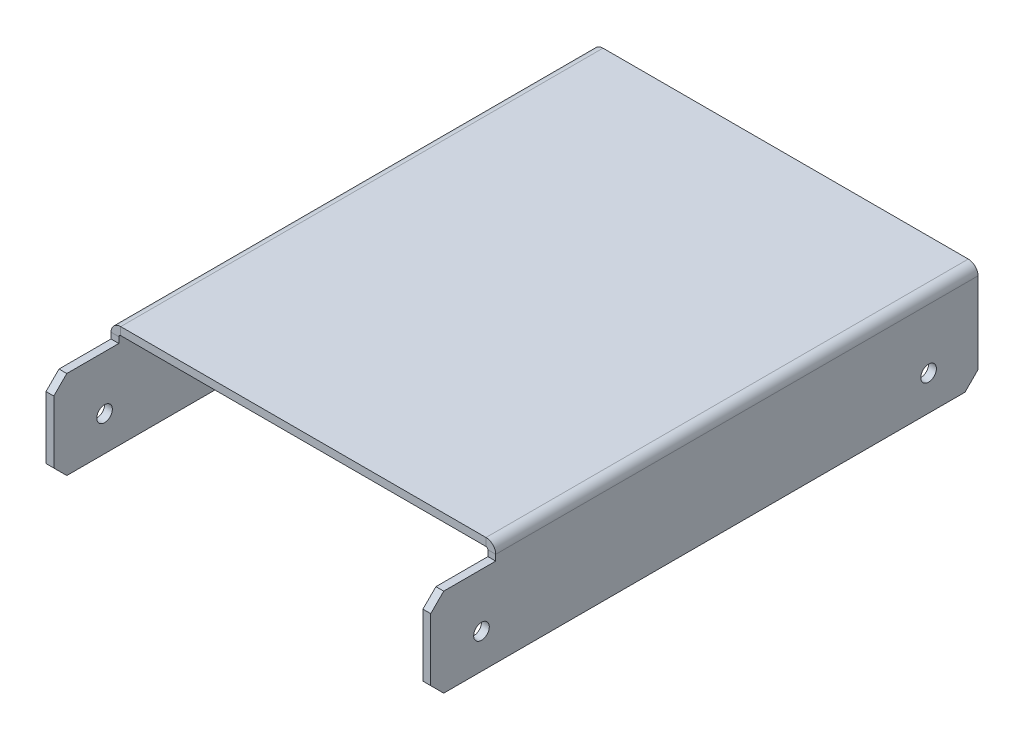
ISO-10303-21;
HEADER;
FILE_DESCRIPTION(('STEP AP214'),'2;1');
FILE_NAME('part.step','',(''),(''),'','','');
FILE_SCHEMA(('AUTOMOTIVE_DESIGN { 1 0 10303 214 1 1 1 1 }'));
ENDSEC;
DATA;
#1=APPLICATION_CONTEXT('core data for automotive mechanical design processes');
#2=APPLICATION_PROTOCOL_DEFINITION('international standard','automotive_design',2000,#1);
#3=PRODUCT_CONTEXT('',#1,'mechanical');
#4=PRODUCT('Part','Part','',(#3));
#5=PRODUCT_RELATED_PRODUCT_CATEGORY('part','',(#4));
#6=PRODUCT_DEFINITION_FORMATION('','',#4);
#7=PRODUCT_DEFINITION_CONTEXT('part definition',#1,'design');
#8=PRODUCT_DEFINITION('design','',#6,#7);
#9=PRODUCT_DEFINITION_SHAPE('','',#8);
#10=(LENGTH_UNIT() NAMED_UNIT(*) SI_UNIT(.MILLI.,.METRE.));
#11=(NAMED_UNIT(*) PLANE_ANGLE_UNIT() SI_UNIT($,.RADIAN.));
#12=(NAMED_UNIT(*) SI_UNIT($,.STERADIAN.) SOLID_ANGLE_UNIT());
#13=UNCERTAINTY_MEASURE_WITH_UNIT(LENGTH_MEASURE(1.E-05),#10,'distance_accuracy_value','');
#14=(GEOMETRIC_REPRESENTATION_CONTEXT(3) GLOBAL_UNCERTAINTY_ASSIGNED_CONTEXT((#13)) GLOBAL_UNIT_ASSIGNED_CONTEXT((#10,
#11,#12)) REPRESENTATION_CONTEXT('',''));
#15=CARTESIAN_POINT('',(0.,0.,0.));
#16=DIRECTION('',(0.,0.,1.));
#17=DIRECTION('',(1.,0.,0.));
#18=AXIS2_PLACEMENT_3D('',#15,#16,#17);
#19=CARTESIAN_POINT('',(0.,0.,141.336888069935));
#20=DIRECTION('',(0.,0.,-1.));
#21=DIRECTION('',(-1.,0.,0.));
#22=AXIS2_PLACEMENT_3D('',#19,#20,#21);
#23=PLANE('',#22);
#24=DIRECTION('',(0.,1.,0.));
#25=VECTOR('',#24,1.);
#26=CARTESIAN_POINT('',(-145.,5.55111512312578E-13,141.336888069935));
#27=LINE('',#26,#25);
#28=CARTESIAN_POINT('',(-145.,-6.,141.336888069935));
#29=VERTEX_POINT('',#28);
#30=CARTESIAN_POINT('',(-145.,-3.73660000000001,141.336888069935));
#31=VERTEX_POINT('',#30);
#32=EDGE_CURVE('E422',#29,#31,#27,.T.);
#33=ORIENTED_EDGE('',*,*,#32,.T.);
#34=DIRECTION('',(-1.,0.,0.));
#35=VECTOR('',#34,1.);
#36=CARTESIAN_POINT('',(-145.,-3.73660000000001,141.336888069935));
#37=LINE('',#36,#35);
#38=CARTESIAN_POINT('',(-148.,-3.7366,141.336888069935));
#39=VERTEX_POINT('',#38);
#40=EDGE_CURVE('E445',#31,#39,#37,.T.);
#41=ORIENTED_EDGE('',*,*,#40,.T.);
#42=DIRECTION('',(0.,1.,0.));
#43=VECTOR('',#42,1.);
#44=CARTESIAN_POINT('',(-148.,5.65585956329108E-13,141.336888069935));
#45=LINE('',#44,#43);
#46=CARTESIAN_POINT('',(-148.,-6.,141.336888069935));
#47=VERTEX_POINT('',#46);
#48=EDGE_CURVE('E315',#47,#39,#45,.T.);
#49=ORIENTED_EDGE('',*,*,#48,.F.);
#50=DIRECTION('',(1.,0.,0.));
#51=VECTOR('',#50,1.);
#52=CARTESIAN_POINT('',(-159.,-6.,141.336888069935));
#53=LINE('',#52,#51);
#54=EDGE_CURVE('E301',#47,#29,#53,.T.);
#55=ORIENTED_EDGE('',*,*,#54,.T.);
#56=EDGE_LOOP('',(#33,#41,#49,#55));
#57=FACE_BOUND('',#56,.T.);
#58=ADVANCED_FACE('F84',(#57),#23,.F.);
#59=DIRECTION('',(1.,0.,0.));
#60=VECTOR('',#59,1.);
#61=CARTESIAN_POINT('',(0.,0.,141.336888069935));
#62=LINE('',#61,#60);
#63=CARTESIAN_POINT('',(-144.2634,0.,141.336888069935));
#64=VERTEX_POINT('',#63);
#65=CARTESIAN_POINT('',(-3.73660000000001,0.,141.336888069935));
#66=VERTEX_POINT('',#65);
#67=EDGE_CURVE('E323',#64,#66,#62,.T.);
#68=ORIENTED_EDGE('',*,*,#67,.F.);
#69=DIRECTION('',(0.,-1.,0.));
#70=VECTOR('',#69,1.);
#71=CARTESIAN_POINT('',(-144.2634,0.,141.336888069935));
#72=LINE('',#71,#70);
#73=CARTESIAN_POINT('',(-144.2634,-3.00000000000001,141.336888069935));
#74=VERTEX_POINT('',#73);
#75=EDGE_CURVE('E442',#64,#74,#72,.T.);
#76=ORIENTED_EDGE('',*,*,#75,.T.);
#77=DIRECTION('',(1.,0.,0.));
#78=VECTOR('',#77,1.);
#79=CARTESIAN_POINT('',(0.,-3.,141.336888069935));
#80=LINE('',#79,#78);
#81=CARTESIAN_POINT('',(-3.73660000000001,-3.,141.336888069935));
#82=VERTEX_POINT('',#81);
#83=EDGE_CURVE('E306',#74,#82,#80,.T.);
#84=ORIENTED_EDGE('',*,*,#83,.T.);
#85=DIRECTION('',(0.,1.,0.));
#86=VECTOR('',#85,1.);
#87=CARTESIAN_POINT('',(-3.73660000000001,-3.,141.336888069935));
#88=LINE('',#87,#86);
#89=EDGE_CURVE('E439',#82,#66,#88,.T.);
#90=ORIENTED_EDGE('',*,*,#89,.T.);
#91=EDGE_LOOP('',(#68,#76,#84,#90));
#92=FACE_BOUND('',#91,.T.);
#93=ADVANCED_FACE('F585',(#92),#23,.F.);
#94=ORIENTED_EDGE('',*,*,#40,.F.);
#95=CARTESIAN_POINT('',(-144.2634,-3.73660000000001,141.336888069935));
#96=DIRECTION('',(0.,0.,-1.));
#97=DIRECTION('',(-1.,0.,0.));
#98=AXIS2_PLACEMENT_3D('',#95,#96,#97);
#99=CIRCLE('',#98,0.736600000000004);
#100=EDGE_CURVE('E302',#74,#31,#99,.F.);
#101=ORIENTED_EDGE('',*,*,#100,.F.);
#102=ORIENTED_EDGE('',*,*,#75,.F.);
#103=CARTESIAN_POINT('',(-144.2634,-3.73660000000001,141.336888069935));
#104=DIRECTION('',(0.,0.,-1.));
#105=DIRECTION('',(-1.,0.,0.));
#106=AXIS2_PLACEMENT_3D('',#103,#104,#105);
#107=CIRCLE('',#106,3.7366);
#108=EDGE_CURVE('E319',#64,#39,#107,.F.);
#109=ORIENTED_EDGE('',*,*,#108,.T.);
#110=EDGE_LOOP('',(#94,#101,#102,#109));
#111=FACE_BOUND('',#110,.T.);
#112=ADVANCED_FACE('F592',(#111),#23,.F.);
#113=DIRECTION('',(0.,-1.,0.));
#114=VECTOR('',#113,1.);
#115=CARTESIAN_POINT('',(0.,0.,141.336888069935));
#116=LINE('',#115,#114);
#117=CARTESIAN_POINT('',(0.,-3.73659999999999,141.336888069935));
#118=VERTEX_POINT('',#117);
#119=CARTESIAN_POINT('',(0.,-6.,141.336888069935));
#120=VERTEX_POINT('',#119);
#121=EDGE_CURVE('E331',#118,#120,#116,.T.);
#122=ORIENTED_EDGE('',*,*,#121,.F.);
#123=DIRECTION('',(-1.,0.,0.));
#124=VECTOR('',#123,1.);
#125=CARTESIAN_POINT('',(0.,-3.73659999999999,141.336888069935));
#126=LINE('',#125,#124);
#127=CARTESIAN_POINT('',(-3.,-3.7366,141.336888069935));
#128=VERTEX_POINT('',#127);
#129=EDGE_CURVE('E436',#118,#128,#126,.T.);
#130=ORIENTED_EDGE('',*,*,#129,.T.);
#131=DIRECTION('',(0.,-1.,0.));
#132=VECTOR('',#131,1.);
#133=CARTESIAN_POINT('',(-3.00000000000001,0.,141.336888069935));
#134=LINE('',#133,#132);
#135=CARTESIAN_POINT('',(-3.,-6.,141.336888069935));
#136=VERTEX_POINT('',#135);
#137=EDGE_CURVE('E312',#128,#136,#134,.T.);
#138=ORIENTED_EDGE('',*,*,#137,.T.);
#139=EDGE_CURVE('E297',#136,#120,#53,.T.);
#140=ORIENTED_EDGE('',*,*,#139,.T.);
#141=EDGE_LOOP('',(#122,#130,#138,#140));
#142=FACE_BOUND('',#141,.T.);
#143=ADVANCED_FACE('F555',(#142),#23,.F.);
#144=CARTESIAN_POINT('',(0.,-3.,0.));
#145=DIRECTION('',(0.,-1.,0.));
#146=DIRECTION('',(0.,0.,-1.));
#147=AXIS2_PLACEMENT_3D('',#144,#145,#146);
#148=PLANE('',#147);
#149=ORIENTED_EDGE('',*,*,#83,.F.);
#150=DIRECTION('',(0.,0.,-1.));
#151=VECTOR('',#150,1.);
#152=CARTESIAN_POINT('',(-144.2634,-3.00000000000001,-39.1965119300641));
#153=LINE('',#152,#151);
#154=CARTESIAN_POINT('',(-144.2634,-3.00000000000001,-44.1965119300641));
#155=VERTEX_POINT('',#154);
#156=EDGE_CURVE('E256',#155,#74,#153,.F.);
#157=ORIENTED_EDGE('',*,*,#156,.F.);
#158=DIRECTION('',(-1.,0.,0.));
#159=VECTOR('',#158,1.);
#160=CARTESIAN_POINT('',(-3.73660000000001,-3.,-44.1965119300641));
#161=LINE('',#160,#159);
#162=CARTESIAN_POINT('',(-3.73660000000001,-3.,-44.1965119300641));
#163=VERTEX_POINT('',#162);
#164=EDGE_CURVE('E253',#163,#155,#161,.T.);
#165=ORIENTED_EDGE('',*,*,#164,.F.);
#166=DIRECTION('',(0.,0.,1.));
#167=VECTOR('',#166,1.);
#168=CARTESIAN_POINT('',(-3.7366,-3.,166.336888069935));
#169=LINE('',#168,#167);
#170=EDGE_CURVE('E238',#82,#163,#169,.F.);
#171=ORIENTED_EDGE('',*,*,#170,.F.);
#172=EDGE_LOOP('',(#149,#157,#165,#171));
#173=FACE_BOUND('',#172,.T.);
#174=ADVANCED_FACE('F254',(#173),#148,.T.);
#175=CARTESIAN_POINT('',(0.,0.,0.));
#176=DIRECTION('',(0.,-1.,0.));
#177=DIRECTION('',(0.,0.,-1.));
#178=AXIS2_PLACEMENT_3D('',#175,#176,#177);
#179=PLANE('',#178);
#180=DIRECTION('',(0.,0.,-1.));
#181=VECTOR('',#180,1.);
#182=CARTESIAN_POINT('',(-144.2634,0.,-39.1965119300641));
#183=LINE('',#182,#181);
#184=CARTESIAN_POINT('',(-144.2634,0.,-44.1965119300641));
#185=VERTEX_POINT('',#184);
#186=EDGE_CURVE('E394',#185,#64,#183,.F.);
#187=ORIENTED_EDGE('',*,*,#186,.T.);
#188=ORIENTED_EDGE('',*,*,#67,.T.);
#189=DIRECTION('',(0.,0.,1.));
#190=VECTOR('',#189,1.);
#191=CARTESIAN_POINT('',(-3.7366,0.,166.336888069935));
#192=LINE('',#191,#190);
#193=CARTESIAN_POINT('',(-3.73660000000001,0.,-44.1965119300641));
#194=VERTEX_POINT('',#193);
#195=EDGE_CURVE('E249',#66,#194,#192,.F.);
#196=ORIENTED_EDGE('',*,*,#195,.T.);
#197=DIRECTION('',(1.,0.,0.));
#198=VECTOR('',#197,1.);
#199=CARTESIAN_POINT('',(-144.2634,0.,-44.1965119300641));
#200=LINE('',#199,#198);
#201=EDGE_CURVE('E284',#185,#194,#200,.T.);
#202=ORIENTED_EDGE('',*,*,#201,.F.);
#203=EDGE_LOOP('',(#187,#188,#196,#202));
#204=FACE_BOUND('',#203,.T.);
#205=ADVANCED_FACE('F530',(#204),#179,.F.);
#206=CARTESIAN_POINT('',(-3.7366,-3.7366,166.336888069935));
#207=DIRECTION('',(0.,0.,1.));
#208=DIRECTION('',(1.,0.,0.));
#209=AXIS2_PLACEMENT_3D('',#206,#207,#208);
#210=CYLINDRICAL_SURFACE('',#209,3.7366);
#211=CARTESIAN_POINT('',(-3.7366,-3.7366,141.336888069935));
#212=DIRECTION('',(0.,0.,-1.));
#213=DIRECTION('',(-1.,0.,0.));
#214=AXIS2_PLACEMENT_3D('',#211,#212,#213);
#215=CIRCLE('',#214,3.7366);
#216=EDGE_CURVE('E327',#118,#66,#215,.F.);
#217=ORIENTED_EDGE('',*,*,#216,.F.);
#218=DIRECTION('',(0.,0.,1.));
#219=VECTOR('',#218,1.);
#220=CARTESIAN_POINT('',(0.,-3.73659999999999,-39.1965119300641));
#221=LINE('',#220,#219);
#222=CARTESIAN_POINT('',(0.,-3.73659999999999,-44.1965119300641));
#223=VERTEX_POINT('',#222);
#224=EDGE_CURVE('E416',#118,#223,#221,.F.);
#225=ORIENTED_EDGE('',*,*,#224,.T.);
#226=CARTESIAN_POINT('',(-3.7366,-3.7366,-44.1965119300641));
#227=DIRECTION('',(0.,0.,-1.));
#228=DIRECTION('',(-1.,0.,0.));
#229=AXIS2_PLACEMENT_3D('',#226,#227,#228);
#230=CIRCLE('',#229,3.7366);
#231=EDGE_CURVE('E288',#194,#223,#230,.T.);
#232=ORIENTED_EDGE('',*,*,#231,.F.);
#233=ORIENTED_EDGE('',*,*,#195,.F.);
#234=EDGE_LOOP('',(#217,#225,#232,#233));
#235=FACE_BOUND('',#234,.T.);
#236=ADVANCED_FACE('F535',(#235),#210,.T.);
#237=CARTESIAN_POINT('',(-3.7366,-3.7366,166.336888069935));
#238=DIRECTION('',(0.,0.,1.));
#239=DIRECTION('',(1.,0.,0.));
#240=AXIS2_PLACEMENT_3D('',#237,#238,#239);
#241=CYLINDRICAL_SURFACE('',#240,0.7366);
#242=DIRECTION('',(0.,0.,1.));
#243=VECTOR('',#242,1.);
#244=CARTESIAN_POINT('',(-3.,-3.7366,-39.1965119300641));
#245=LINE('',#244,#243);
#246=CARTESIAN_POINT('',(-3.,-3.7366,-44.1965119300641));
#247=VERTEX_POINT('',#246);
#248=EDGE_CURVE('E398',#247,#128,#245,.T.);
#249=ORIENTED_EDGE('',*,*,#248,.T.);
#250=CARTESIAN_POINT('',(-3.7366,-3.7366,141.336888069935));
#251=DIRECTION('',(0.,0.,-1.));
#252=DIRECTION('',(-1.,0.,0.));
#253=AXIS2_PLACEMENT_3D('',#250,#251,#252);
#254=CIRCLE('',#253,0.7366);
#255=EDGE_CURVE('E245',#128,#82,#254,.F.);
#256=ORIENTED_EDGE('',*,*,#255,.T.);
#257=ORIENTED_EDGE('',*,*,#170,.T.);
#258=CARTESIAN_POINT('',(-3.7366,-3.7366,-44.1965119300641));
#259=DIRECTION('',(0.,0.,1.));
#260=DIRECTION('',(-1.,0.,0.));
#261=AXIS2_PLACEMENT_3D('',#258,#259,#260);
#262=CIRCLE('',#261,0.7366);
#263=EDGE_CURVE('E243',#247,#163,#262,.T.);
#264=ORIENTED_EDGE('',*,*,#263,.F.);
#265=EDGE_LOOP('',(#249,#256,#257,#264));
#266=FACE_BOUND('',#265,.T.);
#267=ADVANCED_FACE('F241',(#266),#241,.F.);
#268=CARTESIAN_POINT('',(1.29236898960272E-13,-40.,166.336888069935));
#269=DIRECTION('',(0.,0.,-1.));
#270=DIRECTION('',(-1.,0.,0.));
#271=AXIS2_PLACEMENT_3D('',#268,#269,#270);
#272=PLANE('',#271);
#273=DIRECTION('',(0.,1.,0.));
#274=VECTOR('',#273,1.);
#275=CARTESIAN_POINT('',(-2.99999999999987,-40.,166.336888069935));
#276=LINE('',#275,#274);
#277=CARTESIAN_POINT('',(-2.99999999999997,-11.,166.336888069935));
#278=VERTEX_POINT('',#277);
#279=CARTESIAN_POINT('',(-2.99999999999989,-35.,166.336888069935));
#280=VERTEX_POINT('',#279);
#281=EDGE_CURVE('E412',#278,#280,#276,.F.);
#282=ORIENTED_EDGE('',*,*,#281,.T.);
#283=DIRECTION('',(1.,0.,0.));
#284=VECTOR('',#283,1.);
#285=CARTESIAN_POINT('',(1.11779492266056E-13,-35.,166.336888069935));
#286=LINE('',#285,#284);
#287=CARTESIAN_POINT('',(1.11793506003649E-13,-35.,166.336888069935));
#288=VERTEX_POINT('',#287);
#289=EDGE_CURVE('E467',#280,#288,#286,.T.);
#290=ORIENTED_EDGE('',*,*,#289,.T.);
#291=DIRECTION('',(0.,-1.,0.));
#292=VECTOR('',#291,1.);
#293=CARTESIAN_POINT('',(0.,0.,166.336888069935));
#294=LINE('',#293,#292);
#295=CARTESIAN_POINT('',(0.,-11.,166.336888069935));
#296=VERTEX_POINT('',#295);
#297=EDGE_CURVE('E404',#296,#288,#294,.T.);
#298=ORIENTED_EDGE('',*,*,#297,.F.);
#299=DIRECTION('',(-1.,0.,0.));
#300=VECTOR('',#299,1.);
#301=CARTESIAN_POINT('',(1.29236898960272E-13,-11.,166.336888069935));
#302=LINE('',#301,#300);
#303=EDGE_CURVE('E464',#296,#278,#302,.T.);
#304=ORIENTED_EDGE('',*,*,#303,.T.);
#305=EDGE_LOOP('',(#282,#290,#298,#304));
#306=FACE_BOUND('',#305,.T.);
#307=ADVANCED_FACE('F564',(#306),#272,.F.);
#308=CARTESIAN_POINT('',(0.,0.,0.));
#309=DIRECTION('',(-1.,0.,0.));
#310=DIRECTION('',(0.,-1.,0.));
#311=AXIS2_PLACEMENT_3D('',#308,#309,#310);
#312=PLANE('',#311);
#313=CARTESIAN_POINT('',(1.66533453693773E-13,-26.6400000000005,-25.1965119300641));
#314=DIRECTION('',(-1.,0.,0.));
#315=DIRECTION('',(0.,-1.,0.));
#316=AXIS2_PLACEMENT_3D('',#313,#314,#315);
#317=CIRCLE('',#316,2.99999999999999);
#318=CARTESIAN_POINT('',(1.57281595155231E-13,-29.6400000000005,-25.1965119300641));
#319=VERTEX_POINT('',#318);
#320=EDGE_CURVE('E347',#319,#319,#317,.T.);
#321=ORIENTED_EDGE('',*,*,#320,.T.);
#322=EDGE_LOOP('',(#321));
#323=FACE_BOUND('',#322,.T.);
#324=CARTESIAN_POINT('',(1.66533453693773E-13,-26.6400000000005,146.806888069935));
#325=DIRECTION('',(-1.,0.,0.));
#326=DIRECTION('',(0.,-1.,0.));
#327=AXIS2_PLACEMENT_3D('',#324,#325,#326);
#328=CIRCLE('',#327,2.99999999999999);
#329=CARTESIAN_POINT('',(1.57281595155231E-13,-29.6400000000005,146.806888069935));
#330=VERTEX_POINT('',#329);
#331=EDGE_CURVE('E356',#330,#330,#328,.T.);
#332=ORIENTED_EDGE('',*,*,#331,.T.);
#333=EDGE_LOOP('',(#332));
#334=FACE_BOUND('',#333,.T.);
#335=ORIENTED_EDGE('',*,*,#297,.T.);
#336=DIRECTION('',(0.,0.707106781186551,0.707106781186544));
#337=VECTOR('',#336,1.);
#338=CARTESIAN_POINT('',(1.29236898960272E-13,-40.,161.336888069935));
#339=LINE('',#338,#337);
#340=CARTESIAN_POINT('',(1.29250912697865E-13,-40.,161.336888069935));
#341=VERTEX_POINT('',#340);
#342=EDGE_CURVE('E476',#288,#341,#339,.F.);
#343=ORIENTED_EDGE('',*,*,#342,.T.);
#344=DIRECTION('',(0.,0.,-1.));
#345=VECTOR('',#344,1.);
#346=CARTESIAN_POINT('',(1.29250912697865E-13,-40.,0.));
#347=LINE('',#346,#345);
#348=CARTESIAN_POINT('',(1.29250912697865E-13,-40.,-39.1965119300641));
#349=VERTEX_POINT('',#348);
#350=EDGE_CURVE('E250',#341,#349,#347,.T.);
#351=ORIENTED_EDGE('',*,*,#350,.T.);
#352=DIRECTION('',(0.,0.707106781186543,-0.707106781186552));
#353=VECTOR('',#352,1.);
#354=CARTESIAN_POINT('',(1.11889664200504E-13,-35.,-44.1965119300641));
#355=LINE('',#354,#353);
#356=CARTESIAN_POINT('',(1.11788563954518E-13,-35.,-44.1965119300641));
#357=VERTEX_POINT('',#356);
#358=EDGE_CURVE('E470',#349,#357,#355,.T.);
#359=ORIENTED_EDGE('',*,*,#358,.T.);
#360=DIRECTION('',(0.,-1.,0.));
#361=VECTOR('',#360,1.);
#362=CARTESIAN_POINT('',(0.,-3.73659999999999,-44.1965119300641));
#363=LINE('',#362,#361);
#364=EDGE_CURVE('E292',#223,#357,#363,.T.);
#365=ORIENTED_EDGE('',*,*,#364,.F.);
#366=ORIENTED_EDGE('',*,*,#224,.F.);
#367=ORIENTED_EDGE('',*,*,#121,.T.);
#368=DIRECTION('',(0.,0.,1.));
#369=VECTOR('',#368,1.);
#370=CARTESIAN_POINT('',(0.,-6.,0.));
#371=LINE('',#370,#369);
#372=CARTESIAN_POINT('',(0.,-6.,161.336888069935));
#373=VERTEX_POINT('',#372);
#374=EDGE_CURVE('E342',#120,#373,#371,.T.);
#375=ORIENTED_EDGE('',*,*,#374,.T.);
#376=DIRECTION('',(0.,0.707106781186551,-0.707106781186544));
#377=VECTOR('',#376,1.);
#378=CARTESIAN_POINT('',(0.,-5.99999999999972,161.336888069935));
#379=LINE('',#378,#377);
#380=EDGE_CURVE('E473',#373,#296,#379,.F.);
#381=ORIENTED_EDGE('',*,*,#380,.T.);
#382=EDGE_LOOP('',(#335,#343,#351,#359,#365,#366,#367,#375,#381));
#383=FACE_BOUND('',#382,.T.);
#384=ADVANCED_FACE('F540',(#323,#334,#383),#312,.F.);
#385=CARTESIAN_POINT('',(-3.00000000000001,0.,0.));
#386=DIRECTION('',(-1.,0.,0.));
#387=DIRECTION('',(0.,-1.,0.));
#388=AXIS2_PLACEMENT_3D('',#385,#386,#387);
#389=PLANE('',#388);
#390=DIRECTION('',(0.,0.,1.));
#391=VECTOR('',#390,1.);
#392=CARTESIAN_POINT('',(-2.99999999999987,-40.,-39.1965119300641));
#393=LINE('',#392,#391);
#394=CARTESIAN_POINT('',(-2.99999999999987,-40.,161.336888069935));
#395=VERTEX_POINT('',#394);
#396=CARTESIAN_POINT('',(-2.99999999999987,-40.,-39.1965119300641));
#397=VERTEX_POINT('',#396);
#398=EDGE_CURVE('E408',#395,#397,#393,.F.);
#399=ORIENTED_EDGE('',*,*,#398,.F.);
#400=DIRECTION('',(0.,-0.707106781186551,-0.707106781186544));
#401=VECTOR('',#400,1.);
#402=CARTESIAN_POINT('',(-2.99999999999966,-100.668444034967,100.668444034969));
#403=LINE('',#402,#401);
#404=EDGE_CURVE('E461',#395,#280,#403,.F.);
#405=ORIENTED_EDGE('',*,*,#404,.T.);
#406=ORIENTED_EDGE('',*,*,#281,.F.);
#407=DIRECTION('',(0.,-0.707106781186551,0.707106781186544));
#408=VECTOR('',#407,1.);
#409=CARTESIAN_POINT('',(-3.00000000000028,77.6684440349677,77.6684440349686));
#410=LINE('',#409,#408);
#411=CARTESIAN_POINT('',(-2.99999999999999,-6.,161.336888069935));
#412=VERTEX_POINT('',#411);
#413=EDGE_CURVE('E458',#278,#412,#410,.F.);
#414=ORIENTED_EDGE('',*,*,#413,.T.);
#415=DIRECTION('',(0.,0.,1.));
#416=VECTOR('',#415,1.);
#417=CARTESIAN_POINT('',(-2.99999999999999,-6.,0.));
#418=LINE('',#417,#416);
#419=EDGE_CURVE('E338',#136,#412,#418,.T.);
#420=ORIENTED_EDGE('',*,*,#419,.F.);
#421=ORIENTED_EDGE('',*,*,#137,.F.);
#422=ORIENTED_EDGE('',*,*,#248,.F.);
#423=DIRECTION('',(0.,1.,0.));
#424=VECTOR('',#423,1.);
#425=CARTESIAN_POINT('',(-2.99999999999987,-40.,-44.1965119300641));
#426=LINE('',#425,#424);
#427=CARTESIAN_POINT('',(-2.99999999999989,-35.0000000000001,-44.1965119300641));
#428=VERTEX_POINT('',#427);
#429=EDGE_CURVE('E266',#428,#247,#426,.T.);
#430=ORIENTED_EDGE('',*,*,#429,.F.);
#431=DIRECTION('',(0.,-0.707106781186543,0.707106781186552));
#432=VECTOR('',#431,1.);
#433=CARTESIAN_POINT('',(-2.99999999999987,-39.5982559650323,-39.5982559650318));
#434=LINE('',#433,#432);
#435=EDGE_CURVE('E455',#428,#397,#434,.T.);
#436=ORIENTED_EDGE('',*,*,#435,.T.);
#437=EDGE_LOOP('',(#399,#405,#406,#414,#420,#421,#422,#430,#436));
#438=FACE_BOUND('',#437,.T.);
#439=CARTESIAN_POINT('',(-2.99999999999992,-26.6400000000005,-25.1965119300641));
#440=DIRECTION('',(-1.,0.,0.));
#441=DIRECTION('',(0.,-1.,0.));
#442=AXIS2_PLACEMENT_3D('',#439,#440,#441);
#443=CIRCLE('',#442,2.99999999999999);
#444=CARTESIAN_POINT('',(-2.99999999999991,-29.6400000000005,-25.1965119300641));
#445=VERTEX_POINT('',#444);
#446=EDGE_CURVE('E368',#445,#445,#443,.T.);
#447=ORIENTED_EDGE('',*,*,#446,.F.);
#448=EDGE_LOOP('',(#447));
#449=FACE_BOUND('',#448,.T.);
#450=CARTESIAN_POINT('',(-2.99999999999992,-26.6400000000005,146.806888069935));
#451=DIRECTION('',(-1.,0.,0.));
#452=DIRECTION('',(0.,-1.,0.));
#453=AXIS2_PLACEMENT_3D('',#450,#451,#452);
#454=CIRCLE('',#453,2.99999999999999);
#455=CARTESIAN_POINT('',(-2.99999999999991,-29.6400000000005,146.806888069935));
#456=VERTEX_POINT('',#455);
#457=EDGE_CURVE('E363',#456,#456,#454,.T.);
#458=ORIENTED_EDGE('',*,*,#457,.F.);
#459=EDGE_LOOP('',(#458));
#460=FACE_BOUND('',#459,.T.);
#461=ADVANCED_FACE('F548',(#438,#449,#460),#389,.T.);
#462=CARTESIAN_POINT('',(1.29236898960272E-13,-40.,-39.1965119300641));
#463=DIRECTION('',(0.,1.,0.));
#464=DIRECTION('',(-1.,0.,0.));
#465=AXIS2_PLACEMENT_3D('',#462,#463,#464);
#466=PLANE('',#465);
#467=ORIENTED_EDGE('',*,*,#350,.F.);
#468=DIRECTION('',(-1.,0.,0.));
#469=VECTOR('',#468,1.);
#470=CARTESIAN_POINT('',(1.29236898960272E-13,-40.,161.336888069935));
#471=LINE('',#470,#469);
#472=EDGE_CURVE('E451',#341,#395,#471,.T.);
#473=ORIENTED_EDGE('',*,*,#472,.T.);
#474=ORIENTED_EDGE('',*,*,#398,.T.);
#475=DIRECTION('',(1.,0.,0.));
#476=VECTOR('',#475,1.);
#477=CARTESIAN_POINT('',(1.29250912697865E-13,-40.,-39.1965119300641));
#478=LINE('',#477,#476);
#479=EDGE_CURVE('E448',#397,#349,#478,.T.);
#480=ORIENTED_EDGE('',*,*,#479,.T.);
#481=EDGE_LOOP('',(#467,#473,#474,#480));
#482=FACE_BOUND('',#481,.T.);
#483=ADVANCED_FACE('F573',(#482),#466,.F.);
#484=CARTESIAN_POINT('',(-144.2634,-3.73660000000001,-39.1965119300641));
#485=DIRECTION('',(0.,0.,-1.));
#486=DIRECTION('',(-1.,0.,0.));
#487=AXIS2_PLACEMENT_3D('',#484,#485,#486);
#488=CYLINDRICAL_SURFACE('',#487,3.7366);
#489=ORIENTED_EDGE('',*,*,#108,.F.);
#490=ORIENTED_EDGE('',*,*,#186,.F.);
#491=CARTESIAN_POINT('',(-144.2634,-3.73660000000001,-44.1965119300641));
#492=DIRECTION('',(0.,0.,-1.));
#493=DIRECTION('',(-1.,0.,0.));
#494=AXIS2_PLACEMENT_3D('',#491,#492,#493);
#495=CIRCLE('',#494,3.73660000000002);
#496=CARTESIAN_POINT('',(-148.,-3.7366,-44.1965119300641));
#497=VERTEX_POINT('',#496);
#498=EDGE_CURVE('E280',#497,#185,#495,.T.);
#499=ORIENTED_EDGE('',*,*,#498,.F.);
#500=DIRECTION('',(0.,0.,-1.));
#501=VECTOR('',#500,1.);
#502=CARTESIAN_POINT('',(-148.,-3.7366,166.336888069935));
#503=LINE('',#502,#501);
#504=EDGE_CURVE('E388',#497,#39,#503,.F.);
#505=ORIENTED_EDGE('',*,*,#504,.T.);
#506=EDGE_LOOP('',(#489,#490,#499,#505));
#507=FACE_BOUND('',#506,.T.);
#508=ADVANCED_FACE('F526',(#507),#488,.T.);
#509=CARTESIAN_POINT('',(-144.2634,-3.73660000000001,-39.1965119300641));
#510=DIRECTION('',(0.,0.,-1.));
#511=DIRECTION('',(-1.,0.,0.));
#512=AXIS2_PLACEMENT_3D('',#509,#510,#511);
#513=CYLINDRICAL_SURFACE('',#512,0.736600000000004);
#514=ORIENTED_EDGE('',*,*,#156,.T.);
#515=ORIENTED_EDGE('',*,*,#100,.T.);
#516=DIRECTION('',(0.,0.,-1.));
#517=VECTOR('',#516,1.);
#518=CARTESIAN_POINT('',(-145.,-3.73660000000001,166.336888069935));
#519=LINE('',#518,#517);
#520=CARTESIAN_POINT('',(-145.,-3.73660000000001,-44.1965119300641));
#521=VERTEX_POINT('',#520);
#522=EDGE_CURVE('E372',#31,#521,#519,.T.);
#523=ORIENTED_EDGE('',*,*,#522,.T.);
#524=CARTESIAN_POINT('',(-144.2634,-3.73660000000001,-44.1965119300641));
#525=DIRECTION('',(0.,0.,1.));
#526=DIRECTION('',(-1.,0.,0.));
#527=AXIS2_PLACEMENT_3D('',#524,#525,#526);
#528=CIRCLE('',#527,0.736600000000004);
#529=EDGE_CURVE('E261',#155,#521,#528,.T.);
#530=ORIENTED_EDGE('',*,*,#529,.F.);
#531=EDGE_LOOP('',(#514,#515,#523,#530));
#532=FACE_BOUND('',#531,.T.);
#533=ADVANCED_FACE('F580',(#532),#513,.F.);
#534=CARTESIAN_POINT('',(-148.,-2.99999999999999,166.336888069935));
#535=DIRECTION('',(0.,0.,-1.));
#536=DIRECTION('',(-1.,0.,0.));
#537=AXIS2_PLACEMENT_3D('',#534,#535,#536);
#538=PLANE('',#537);
#539=DIRECTION('',(0.,1.,0.));
#540=VECTOR('',#539,1.);
#541=CARTESIAN_POINT('',(-148.,5.65585956329108E-13,166.336888069935));
#542=LINE('',#541,#540);
#543=CARTESIAN_POINT('',(-148.,-35.,166.336888069935));
#544=VERTEX_POINT('',#543);
#545=CARTESIAN_POINT('',(-148.,-11.,166.336888069935));
#546=VERTEX_POINT('',#545);
#547=EDGE_CURVE('E373',#544,#546,#542,.T.);
#548=ORIENTED_EDGE('',*,*,#547,.F.);
#549=DIRECTION('',(1.,0.,0.));
#550=VECTOR('',#549,1.);
#551=CARTESIAN_POINT('',(-148.,-35.,166.336888069935));
#552=LINE('',#551,#550);
#553=CARTESIAN_POINT('',(-145.,-35.,166.336888069935));
#554=VERTEX_POINT('',#553);
#555=EDGE_CURVE('E486',#544,#554,#552,.T.);
#556=ORIENTED_EDGE('',*,*,#555,.T.);
#557=DIRECTION('',(0.,-1.,0.));
#558=VECTOR('',#557,1.);
#559=CARTESIAN_POINT('',(-145.,-3.,166.336888069935));
#560=LINE('',#559,#558);
#561=CARTESIAN_POINT('',(-145.,-11.,166.336888069935));
#562=VERTEX_POINT('',#561);
#563=EDGE_CURVE('E380',#554,#562,#560,.F.);
#564=ORIENTED_EDGE('',*,*,#563,.T.);
#565=DIRECTION('',(-1.,0.,0.));
#566=VECTOR('',#565,1.);
#567=CARTESIAN_POINT('',(-148.,-11.,166.336888069935));
#568=LINE('',#567,#566);
#569=EDGE_CURVE('E483',#562,#546,#568,.T.);
#570=ORIENTED_EDGE('',*,*,#569,.T.);
#571=EDGE_LOOP('',(#548,#556,#564,#570));
#572=FACE_BOUND('',#571,.T.);
#573=ADVANCED_FACE('F634',(#572),#538,.F.);
#574=CARTESIAN_POINT('',(-148.,5.65585956329108E-13,0.));
#575=DIRECTION('',(1.,0.,0.));
#576=DIRECTION('',(0.,1.,0.));
#577=AXIS2_PLACEMENT_3D('',#574,#575,#576);
#578=PLANE('',#577);
#579=CARTESIAN_POINT('',(-148.,-26.64,-25.1965119300641));
#580=DIRECTION('',(-1.,0.,0.));
#581=DIRECTION('',(0.,-1.,0.));
#582=AXIS2_PLACEMENT_3D('',#579,#580,#581);
#583=CIRCLE('',#582,2.99999999999999);
#584=CARTESIAN_POINT('',(-148.,-29.64,-25.1965119300641));
#585=VERTEX_POINT('',#584);
#586=EDGE_CURVE('E352',#585,#585,#583,.T.);
#587=ORIENTED_EDGE('',*,*,#586,.F.);
#588=EDGE_LOOP('',(#587));
#589=FACE_BOUND('',#588,.T.);
#590=CARTESIAN_POINT('',(-148.,-26.64,146.806888069935));
#591=DIRECTION('',(-1.,0.,0.));
#592=DIRECTION('',(0.,-1.,0.));
#593=AXIS2_PLACEMENT_3D('',#590,#591,#592);
#594=CIRCLE('',#593,2.99999999999999);
#595=CARTESIAN_POINT('',(-148.,-29.64,146.806888069935));
#596=VERTEX_POINT('',#595);
#597=EDGE_CURVE('E346',#596,#596,#594,.T.);
#598=ORIENTED_EDGE('',*,*,#597,.F.);
#599=EDGE_LOOP('',(#598));
#600=FACE_BOUND('',#599,.T.);
#601=DIRECTION('',(0.,0.,1.));
#602=VECTOR('',#601,1.);
#603=CARTESIAN_POINT('',(-148.,-40.,0.));
#604=LINE('',#603,#602);
#605=CARTESIAN_POINT('',(-148.,-40.,-39.1965119300642));
#606=VERTEX_POINT('',#605);
#607=CARTESIAN_POINT('',(-148.,-40.,161.336888069935));
#608=VERTEX_POINT('',#607);
#609=EDGE_CURVE('E376',#606,#608,#604,.T.);
#610=ORIENTED_EDGE('',*,*,#609,.T.);
#611=DIRECTION('',(0.,-0.707106781186546,-0.707106781186549));
#612=VECTOR('',#611,1.);
#613=CARTESIAN_POINT('',(-148.,-35.,166.336888069935));
#614=LINE('',#613,#612);
#615=EDGE_CURVE('E509',#608,#544,#614,.F.);
#616=ORIENTED_EDGE('',*,*,#615,.T.);
#617=ORIENTED_EDGE('',*,*,#547,.T.);
#618=DIRECTION('',(0.,-0.707106781186551,0.707106781186544));
#619=VECTOR('',#618,1.);
#620=CARTESIAN_POINT('',(-148.,-6.00000000000002,161.336888069935));
#621=LINE('',#620,#619);
#622=CARTESIAN_POINT('',(-148.,-6.,161.336888069935));
#623=VERTEX_POINT('',#622);
#624=EDGE_CURVE('E109',#546,#623,#621,.F.);
#625=ORIENTED_EDGE('',*,*,#624,.T.);
#626=DIRECTION('',(0.,0.,-1.));
#627=VECTOR('',#626,1.);
#628=CARTESIAN_POINT('',(-148.,-6.,0.));
#629=LINE('',#628,#627);
#630=EDGE_CURVE('E335',#623,#47,#629,.T.);
#631=ORIENTED_EDGE('',*,*,#630,.T.);
#632=ORIENTED_EDGE('',*,*,#48,.T.);
#633=ORIENTED_EDGE('',*,*,#504,.F.);
#634=DIRECTION('',(0.,1.,0.));
#635=VECTOR('',#634,1.);
#636=CARTESIAN_POINT('',(-148.,-40.,-44.1965119300641));
#637=LINE('',#636,#635);
#638=CARTESIAN_POINT('',(-148.,-35.,-44.1965119300641));
#639=VERTEX_POINT('',#638);
#640=EDGE_CURVE('E277',#639,#497,#637,.T.);
#641=ORIENTED_EDGE('',*,*,#640,.F.);
#642=DIRECTION('',(0.,-0.707106781186544,0.707106781186551));
#643=VECTOR('',#642,1.);
#644=CARTESIAN_POINT('',(-148.,-35.,-44.1965119300642));
#645=LINE('',#644,#643);
#646=EDGE_CURVE('E101',#639,#606,#645,.T.);
#647=ORIENTED_EDGE('',*,*,#646,.T.);
#648=EDGE_LOOP('',(#610,#616,#617,#625,#631,#632,#633,#641,#647));
#649=FACE_BOUND('',#648,.T.);
#650=ADVANCED_FACE('F520',(#589,#600,#649),#578,.F.);
#651=CARTESIAN_POINT('',(-145.,5.55111512312578E-13,0.));
#652=DIRECTION('',(1.,0.,0.));
#653=DIRECTION('',(0.,1.,0.));
#654=AXIS2_PLACEMENT_3D('',#651,#652,#653);
#655=PLANE('',#654);
#656=ORIENTED_EDGE('',*,*,#563,.F.);
#657=DIRECTION('',(0.,0.707106781186546,0.707106781186549));
#658=VECTOR('',#657,1.);
#659=CARTESIAN_POINT('',(-145.,-100.668444034967,100.668444034967));
#660=LINE('',#659,#658);
#661=CARTESIAN_POINT('',(-145.,-40.,161.336888069935));
#662=VERTEX_POINT('',#661);
#663=EDGE_CURVE('E496',#554,#662,#660,.F.);
#664=ORIENTED_EDGE('',*,*,#663,.T.);
#665=DIRECTION('',(0.,0.,-1.));
#666=VECTOR('',#665,1.);
#667=CARTESIAN_POINT('',(-145.,-40.,166.336888069935));
#668=LINE('',#667,#666);
#669=CARTESIAN_POINT('',(-145.,-40.,-39.1965119300642));
#670=VERTEX_POINT('',#669);
#671=EDGE_CURVE('E384',#670,#662,#668,.F.);
#672=ORIENTED_EDGE('',*,*,#671,.F.);
#673=DIRECTION('',(0.,0.707106781186544,-0.707106781186551));
#674=VECTOR('',#673,1.);
#675=CARTESIAN_POINT('',(-145.,-39.598255965032,-39.5982559650322));
#676=LINE('',#675,#674);
#677=CARTESIAN_POINT('',(-145.,-35.,-44.1965119300641));
#678=VERTEX_POINT('',#677);
#679=EDGE_CURVE('E490',#670,#678,#676,.T.);
#680=ORIENTED_EDGE('',*,*,#679,.T.);
#681=DIRECTION('',(0.,-1.,0.));
#682=VECTOR('',#681,1.);
#683=CARTESIAN_POINT('',(-145.,-3.73660000000001,-44.1965119300641));
#684=LINE('',#683,#682);
#685=EDGE_CURVE('E273',#521,#678,#684,.T.);
#686=ORIENTED_EDGE('',*,*,#685,.F.);
#687=ORIENTED_EDGE('',*,*,#522,.F.);
#688=ORIENTED_EDGE('',*,*,#32,.F.);
#689=DIRECTION('',(0.,0.,-1.));
#690=VECTOR('',#689,1.);
#691=CARTESIAN_POINT('',(-145.,-6.,0.));
#692=LINE('',#691,#690);
#693=CARTESIAN_POINT('',(-145.,-6.,161.336888069935));
#694=VERTEX_POINT('',#693);
#695=EDGE_CURVE('E433',#694,#29,#692,.T.);
#696=ORIENTED_EDGE('',*,*,#695,.F.);
#697=DIRECTION('',(0.,0.707106781186551,-0.707106781186544));
#698=VECTOR('',#697,1.);
#699=CARTESIAN_POINT('',(-145.,77.668444034968,77.6684440349683));
#700=LINE('',#699,#698);
#701=EDGE_CURVE('E493',#694,#562,#700,.F.);
#702=ORIENTED_EDGE('',*,*,#701,.T.);
#703=EDGE_LOOP('',(#656,#664,#672,#680,#686,#687,#688,#696,#702));
#704=FACE_BOUND('',#703,.T.);
#705=CARTESIAN_POINT('',(-145.,-26.64,-25.1965119300641));
#706=DIRECTION('',(1.,0.,0.));
#707=DIRECTION('',(0.,1.,0.));
#708=AXIS2_PLACEMENT_3D('',#705,#706,#707);
#709=CIRCLE('',#708,2.99999999999999);
#710=CARTESIAN_POINT('',(-145.,-23.64,-25.1965119300641));
#711=VERTEX_POINT('',#710);
#712=EDGE_CURVE('E367',#711,#711,#709,.T.);
#713=ORIENTED_EDGE('',*,*,#712,.F.);
#714=EDGE_LOOP('',(#713));
#715=FACE_BOUND('',#714,.T.);
#716=CARTESIAN_POINT('',(-145.,-26.64,146.806888069935));
#717=DIRECTION('',(1.,0.,0.));
#718=DIRECTION('',(0.,1.,0.));
#719=AXIS2_PLACEMENT_3D('',#716,#717,#718);
#720=CIRCLE('',#719,2.99999999999999);
#721=CARTESIAN_POINT('',(-145.,-23.64,146.806888069935));
#722=VERTEX_POINT('',#721);
#723=EDGE_CURVE('E351',#722,#722,#720,.T.);
#724=ORIENTED_EDGE('',*,*,#723,.F.);
#725=EDGE_LOOP('',(#724));
#726=FACE_BOUND('',#725,.T.);
#727=ADVANCED_FACE('F622',(#704,#715,#726),#655,.T.);
#728=CARTESIAN_POINT('',(-148.,-40.,166.336888069935));
#729=DIRECTION('',(0.,1.,0.));
#730=DIRECTION('',(-1.,0.,0.));
#731=AXIS2_PLACEMENT_3D('',#728,#729,#730);
#732=PLANE('',#731);
#733=ORIENTED_EDGE('',*,*,#671,.T.);
#734=DIRECTION('',(-1.,0.,0.));
#735=VECTOR('',#734,1.);
#736=CARTESIAN_POINT('',(-148.,-40.,161.336888069935));
#737=LINE('',#736,#735);
#738=EDGE_CURVE('E502',#662,#608,#737,.T.);
#739=ORIENTED_EDGE('',*,*,#738,.T.);
#740=ORIENTED_EDGE('',*,*,#609,.F.);
#741=DIRECTION('',(1.,0.,0.));
#742=VECTOR('',#741,1.);
#743=CARTESIAN_POINT('',(-145.,-40.,-39.1965119300642));
#744=LINE('',#743,#742);
#745=EDGE_CURVE('E499',#606,#670,#744,.T.);
#746=ORIENTED_EDGE('',*,*,#745,.T.);
#747=EDGE_LOOP('',(#733,#739,#740,#746));
#748=FACE_BOUND('',#747,.T.);
#749=ADVANCED_FACE('F626',(#748),#732,.F.);
#750=CARTESIAN_POINT('',(1.66533453693773E-13,-26.6400000000005,146.806888069935));
#751=DIRECTION('',(-1.,0.,0.));
#752=DIRECTION('',(0.,-1.,0.));
#753=AXIS2_PLACEMENT_3D('',#750,#751,#752);
#754=CYLINDRICAL_SURFACE('',#753,2.99999999999999);
#755=ORIENTED_EDGE('',*,*,#723,.T.);
#756=EDGE_LOOP('',(#755));
#757=FACE_BOUND('',#756,.T.);
#758=ORIENTED_EDGE('',*,*,#597,.T.);
#759=EDGE_LOOP('',(#758));
#760=FACE_BOUND('',#759,.T.);
#761=ADVANCED_FACE('F688',(#757,#760),#754,.F.);
#762=CARTESIAN_POINT('',(1.66533453693773E-13,-26.6400000000005,-25.1965119300641));
#763=DIRECTION('',(-1.,0.,0.));
#764=DIRECTION('',(0.,-1.,0.));
#765=AXIS2_PLACEMENT_3D('',#762,#763,#764);
#766=CYLINDRICAL_SURFACE('',#765,2.99999999999999);
#767=ORIENTED_EDGE('',*,*,#712,.T.);
#768=EDGE_LOOP('',(#767));
#769=FACE_BOUND('',#768,.T.);
#770=ORIENTED_EDGE('',*,*,#586,.T.);
#771=EDGE_LOOP('',(#770));
#772=FACE_BOUND('',#771,.T.);
#773=ADVANCED_FACE('F698',(#769,#772),#766,.F.);
#774=ORIENTED_EDGE('',*,*,#457,.T.);
#775=EDGE_LOOP('',(#774));
#776=FACE_BOUND('',#775,.T.);
#777=ORIENTED_EDGE('',*,*,#331,.F.);
#778=EDGE_LOOP('',(#777));
#779=FACE_BOUND('',#778,.T.);
#780=ADVANCED_FACE('F700',(#776,#779),#754,.F.);
#781=ORIENTED_EDGE('',*,*,#446,.T.);
#782=EDGE_LOOP('',(#781));
#783=FACE_BOUND('',#782,.T.);
#784=ORIENTED_EDGE('',*,*,#320,.F.);
#785=EDGE_LOOP('',(#784));
#786=FACE_BOUND('',#785,.T.);
#787=ADVANCED_FACE('F703',(#783,#786),#766,.F.);
#788=CARTESIAN_POINT('',(-159.,-6.,141.336888069935));
#789=DIRECTION('',(0.,-1.,0.));
#790=DIRECTION('',(0.,0.,-1.));
#791=AXIS2_PLACEMENT_3D('',#788,#789,#790);
#792=PLANE('',#791);
#793=ORIENTED_EDGE('',*,*,#419,.T.);
#794=DIRECTION('',(1.,0.,0.));
#795=VECTOR('',#794,1.);
#796=CARTESIAN_POINT('',(-159.,-6.,161.336888069935));
#797=LINE('',#796,#795);
#798=EDGE_CURVE('E479',#412,#373,#797,.T.);
#799=ORIENTED_EDGE('',*,*,#798,.T.);
#800=ORIENTED_EDGE('',*,*,#374,.F.);
#801=ORIENTED_EDGE('',*,*,#139,.F.);
#802=EDGE_LOOP('',(#793,#799,#800,#801));
#803=FACE_BOUND('',#802,.T.);
#804=ADVANCED_FACE('F557',(#803),#792,.F.);
#805=ORIENTED_EDGE('',*,*,#630,.F.);
#806=DIRECTION('',(1.,0.,0.));
#807=VECTOR('',#806,1.);
#808=CARTESIAN_POINT('',(-159.,-6.,161.336888069935));
#809=LINE('',#808,#807);
#810=EDGE_CURVE('E512',#623,#694,#809,.T.);
#811=ORIENTED_EDGE('',*,*,#810,.T.);
#812=ORIENTED_EDGE('',*,*,#695,.T.);
#813=ORIENTED_EDGE('',*,*,#54,.F.);
#814=EDGE_LOOP('',(#805,#811,#812,#813));
#815=FACE_BOUND('',#814,.T.);
#816=ADVANCED_FACE('F597',(#815),#792,.F.);
#817=ORIENTED_EDGE('',*,*,#89,.F.);
#818=ORIENTED_EDGE('',*,*,#255,.F.);
#819=ORIENTED_EDGE('',*,*,#129,.F.);
#820=ORIENTED_EDGE('',*,*,#216,.T.);
#821=EDGE_LOOP('',(#817,#818,#819,#820));
#822=FACE_BOUND('',#821,.T.);
#823=ADVANCED_FACE('F588',(#822),#23,.F.);
#824=CARTESIAN_POINT('',(-3.7366,-3.7366,-44.1965119300641));
#825=DIRECTION('',(0.,0.,-1.));
#826=DIRECTION('',(-1.,0.,0.));
#827=AXIS2_PLACEMENT_3D('',#824,#825,#826);
#828=PLANE('',#827);
#829=ORIENTED_EDGE('',*,*,#364,.T.);
#830=DIRECTION('',(-1.,0.,0.));
#831=VECTOR('',#830,1.);
#832=CARTESIAN_POINT('',(-2.99999999999989,-35.0000000000001,-44.1965119300641));
#833=LINE('',#832,#831);
#834=EDGE_CURVE('E13',#357,#428,#833,.T.);
#835=ORIENTED_EDGE('',*,*,#834,.T.);
#836=ORIENTED_EDGE('',*,*,#429,.T.);
#837=ORIENTED_EDGE('',*,*,#263,.T.);
#838=ORIENTED_EDGE('',*,*,#164,.T.);
#839=ORIENTED_EDGE('',*,*,#529,.T.);
#840=ORIENTED_EDGE('',*,*,#685,.T.);
#841=DIRECTION('',(-1.,0.,0.));
#842=VECTOR('',#841,1.);
#843=CARTESIAN_POINT('',(-148.,-35.,-44.1965119300641));
#844=LINE('',#843,#842);
#845=EDGE_CURVE('E94',#678,#639,#844,.T.);
#846=ORIENTED_EDGE('',*,*,#845,.T.);
#847=ORIENTED_EDGE('',*,*,#640,.T.);
#848=ORIENTED_EDGE('',*,*,#498,.T.);
#849=ORIENTED_EDGE('',*,*,#201,.T.);
#850=ORIENTED_EDGE('',*,*,#231,.T.);
#851=EDGE_LOOP('',(#829,#835,#836,#837,#838,#839,#840,#846,#847,#848,#849,#850));
#852=FACE_BOUND('',#851,.T.);
#853=ADVANCED_FACE('F264',(#852),#828,.T.);
#854=CARTESIAN_POINT('',(1.29236898960272E-13,-40.,161.336888069935));
#855=DIRECTION('',(0.,0.707106781186544,-0.707106781186551));
#856=DIRECTION('',(-1.,0.,0.));
#857=AXIS2_PLACEMENT_3D('',#854,#855,#856);
#858=PLANE('',#857);
#859=ORIENTED_EDGE('',*,*,#342,.F.);
#860=ORIENTED_EDGE('',*,*,#289,.F.);
#861=ORIENTED_EDGE('',*,*,#404,.F.);
#862=ORIENTED_EDGE('',*,*,#472,.F.);
#863=EDGE_LOOP('',(#859,#860,#861,#862));
#864=FACE_BOUND('',#863,.T.);
#865=ADVANCED_FACE('F570',(#864),#858,.F.);
#866=CARTESIAN_POINT('',(-159.,-6.,161.336888069935));
#867=DIRECTION('',(0.,-0.707106781186543,-0.707106781186551));
#868=DIRECTION('',(1.,0.,0.));
#869=AXIS2_PLACEMENT_3D('',#866,#867,#868);
#870=PLANE('',#869);
#871=ORIENTED_EDGE('',*,*,#413,.F.);
#872=ORIENTED_EDGE('',*,*,#303,.F.);
#873=ORIENTED_EDGE('',*,*,#380,.F.);
#874=ORIENTED_EDGE('',*,*,#798,.F.);
#875=EDGE_LOOP('',(#871,#872,#873,#874));
#876=FACE_BOUND('',#875,.T.);
#877=ADVANCED_FACE('F568',(#876),#870,.F.);
#878=CARTESIAN_POINT('',(-148.,-35.,166.336888069935));
#879=DIRECTION('',(0.,0.707106781186549,-0.707106781186545));
#880=DIRECTION('',(1.,0.,0.));
#881=AXIS2_PLACEMENT_3D('',#878,#879,#880);
#882=PLANE('',#881);
#883=ORIENTED_EDGE('',*,*,#615,.F.);
#884=ORIENTED_EDGE('',*,*,#738,.F.);
#885=ORIENTED_EDGE('',*,*,#663,.F.);
#886=ORIENTED_EDGE('',*,*,#555,.F.);
#887=EDGE_LOOP('',(#883,#884,#885,#886));
#888=FACE_BOUND('',#887,.T.);
#889=ADVANCED_FACE('F632',(#888),#882,.F.);
#890=CARTESIAN_POINT('',(-159.,-6.,161.336888069935));
#891=DIRECTION('',(0.,-0.707106781186543,-0.707106781186551));
#892=DIRECTION('',(1.,0.,0.));
#893=AXIS2_PLACEMENT_3D('',#890,#891,#892);
#894=PLANE('',#893);
#895=ORIENTED_EDGE('',*,*,#624,.F.);
#896=ORIENTED_EDGE('',*,*,#569,.F.);
#897=ORIENTED_EDGE('',*,*,#701,.F.);
#898=ORIENTED_EDGE('',*,*,#810,.F.);
#899=EDGE_LOOP('',(#895,#896,#897,#898));
#900=FACE_BOUND('',#899,.T.);
#901=ADVANCED_FACE('F638',(#900),#894,.F.);
#902=CARTESIAN_POINT('',(-3.73659999999989,-35.0000000000001,-44.1965119300641));
#903=DIRECTION('',(0.,-0.707106781186552,-0.707106781186543));
#904=DIRECTION('',(1.,0.,0.));
#905=AXIS2_PLACEMENT_3D('',#902,#903,#904);
#906=PLANE('',#905);
#907=ORIENTED_EDGE('',*,*,#358,.F.);
#908=ORIENTED_EDGE('',*,*,#479,.F.);
#909=ORIENTED_EDGE('',*,*,#435,.F.);
#910=ORIENTED_EDGE('',*,*,#834,.F.);
#911=EDGE_LOOP('',(#907,#908,#909,#910));
#912=FACE_BOUND('',#911,.T.);
#913=ADVANCED_FACE('F545',(#912),#906,.T.);
#914=CARTESIAN_POINT('',(-3.73660000000011,-35.0000000000006,-44.1965119300641));
#915=DIRECTION('',(0.,-0.707106781186551,-0.707106781186544));
#916=DIRECTION('',(1.,0.,0.));
#917=AXIS2_PLACEMENT_3D('',#914,#915,#916);
#918=PLANE('',#917);
#919=ORIENTED_EDGE('',*,*,#679,.F.);
#920=ORIENTED_EDGE('',*,*,#745,.F.);
#921=ORIENTED_EDGE('',*,*,#646,.F.);
#922=ORIENTED_EDGE('',*,*,#845,.F.);
#923=EDGE_LOOP('',(#919,#920,#921,#922));
#924=FACE_BOUND('',#923,.T.);
#925=ADVANCED_FACE('F87',(#924),#918,.T.);
#926=CLOSED_SHELL('',(#58,#93,#112,#143,#174,#205,#236,#267,#307,#384,#461,#483,#508,#533,#573,
#650,#727,#749,#761,#773,#780,#787,#804,#816,#823,#853,#865,#877,#889,#901,#913,#925));
#927=MANIFOLD_SOLID_BREP('B2',#926);
#928=ADVANCED_BREP_SHAPE_REPRESENTATION('',(#18,#927),#14);
#929=SHAPE_DEFINITION_REPRESENTATION(#9,#928);
ENDSEC;
END-ISO-10303-21;
